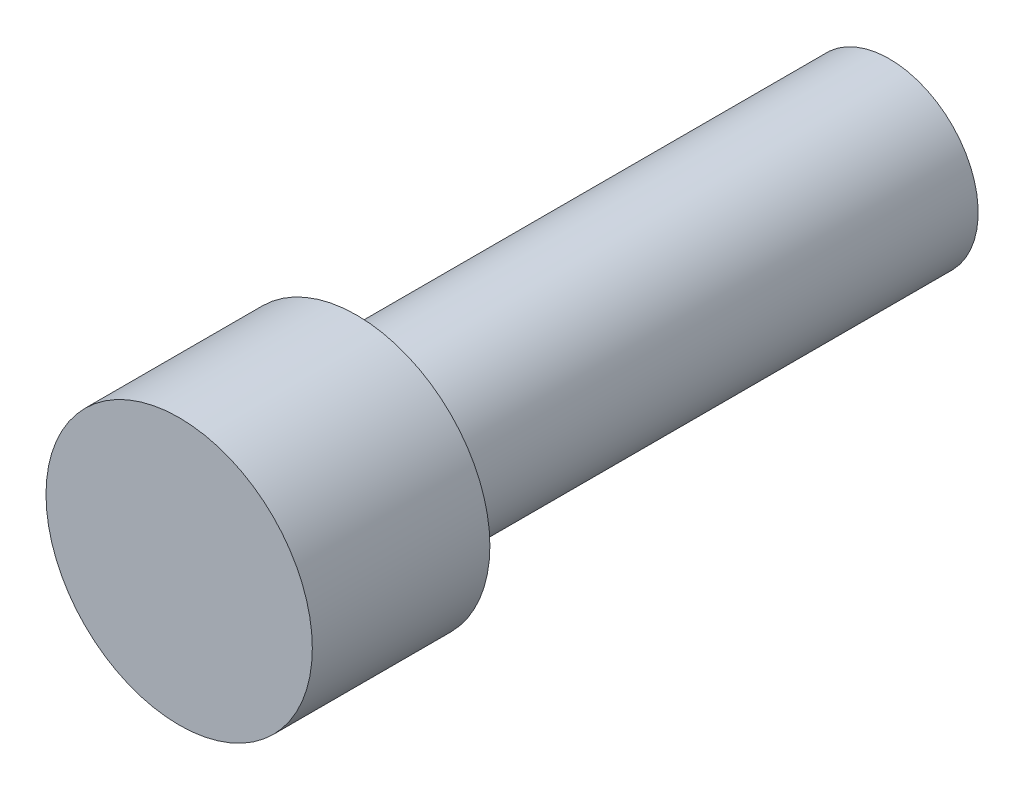
ISO-10303-21;
HEADER;
FILE_DESCRIPTION(('STEP AP214'),'2;1');
FILE_NAME('part.step','',(''),(''),'','','');
FILE_SCHEMA(('AUTOMOTIVE_DESIGN { 1 0 10303 214 1 1 1 1 }'));
ENDSEC;
DATA;
#1=APPLICATION_CONTEXT('core data for automotive mechanical design processes');
#2=APPLICATION_PROTOCOL_DEFINITION('international standard','automotive_design',2000,#1);
#3=PRODUCT_CONTEXT('',#1,'mechanical');
#4=PRODUCT('Part','Part','',(#3));
#5=PRODUCT_RELATED_PRODUCT_CATEGORY('part','',(#4));
#6=PRODUCT_DEFINITION_FORMATION('','',#4);
#7=PRODUCT_DEFINITION_CONTEXT('part definition',#1,'design');
#8=PRODUCT_DEFINITION('design','',#6,#7);
#9=PRODUCT_DEFINITION_SHAPE('','',#8);
#10=(LENGTH_UNIT() NAMED_UNIT(*) SI_UNIT(.MILLI.,.METRE.));
#11=(NAMED_UNIT(*) PLANE_ANGLE_UNIT() SI_UNIT($,.RADIAN.));
#12=(NAMED_UNIT(*) SI_UNIT($,.STERADIAN.) SOLID_ANGLE_UNIT());
#13=UNCERTAINTY_MEASURE_WITH_UNIT(LENGTH_MEASURE(1.E-05),#10,'distance_accuracy_value','');
#14=(GEOMETRIC_REPRESENTATION_CONTEXT(3) GLOBAL_UNCERTAINTY_ASSIGNED_CONTEXT((#13)) GLOBAL_UNIT_ASSIGNED_CONTEXT((#10,
#11,#12)) REPRESENTATION_CONTEXT('',''));
#15=CARTESIAN_POINT('',(0.,0.,0.));
#16=DIRECTION('',(0.,0.,1.));
#17=DIRECTION('',(1.,0.,0.));
#18=AXIS2_PLACEMENT_3D('',#15,#16,#17);
#19=CARTESIAN_POINT('',(0.,0.,2.));
#20=DIRECTION('',(0.,0.,-1.));
#21=DIRECTION('',(-1.,0.,0.));
#22=AXIS2_PLACEMENT_3D('',#19,#20,#21);
#23=CYLINDRICAL_SURFACE('',#22,1.5);
#24=CARTESIAN_POINT('',(0.,0.,2.));
#25=DIRECTION('',(0.,0.,1.));
#26=DIRECTION('',(1.,0.,0.));
#27=AXIS2_PLACEMENT_3D('',#24,#25,#26);
#28=CIRCLE('',#27,1.5);
#29=CARTESIAN_POINT('',(1.5,0.,2.));
#30=VERTEX_POINT('',#29);
#31=EDGE_CURVE('E41',#30,#30,#28,.T.);
#32=ORIENTED_EDGE('',*,*,#31,.F.);
#33=EDGE_LOOP('',(#32));
#34=FACE_BOUND('',#33,.T.);
#35=CARTESIAN_POINT('',(0.,0.,0.));
#36=DIRECTION('',(0.,0.,1.));
#37=DIRECTION('',(1.,0.,0.));
#38=AXIS2_PLACEMENT_3D('',#35,#36,#37);
#39=CIRCLE('',#38,1.5);
#40=CARTESIAN_POINT('',(1.5,0.,0.));
#41=VERTEX_POINT('',#40);
#42=EDGE_CURVE('E37',#41,#41,#39,.T.);
#43=ORIENTED_EDGE('',*,*,#42,.T.);
#44=EDGE_LOOP('',(#43));
#45=FACE_BOUND('',#44,.T.);
#46=ADVANCED_FACE('F34',(#34,#45),#23,.T.);
#47=CARTESIAN_POINT('',(0.,0.,2.));
#48=DIRECTION('',(0.,0.,1.));
#49=DIRECTION('',(1.,0.,0.));
#50=AXIS2_PLACEMENT_3D('',#47,#48,#49);
#51=PLANE('',#50);
#52=ORIENTED_EDGE('',*,*,#31,.T.);
#53=EDGE_LOOP('',(#52));
#54=FACE_BOUND('',#53,.T.);
#55=ADVANCED_FACE('F58',(#54),#51,.T.);
#56=CARTESIAN_POINT('',(0.,0.,0.));
#57=DIRECTION('',(0.,0.,1.));
#58=DIRECTION('',(1.,0.,0.));
#59=AXIS2_PLACEMENT_3D('',#56,#57,#58);
#60=PLANE('',#59);
#61=CARTESIAN_POINT('',(0.,0.,0.));
#62=DIRECTION('',(0.,0.,-1.));
#63=DIRECTION('',(-1.,0.,0.));
#64=AXIS2_PLACEMENT_3D('',#61,#62,#63);
#65=CIRCLE('',#64,1.);
#66=CARTESIAN_POINT('',(-1.,0.,0.));
#67=VERTEX_POINT('',#66);
#68=EDGE_CURVE('E10',#67,#67,#65,.T.);
#69=ORIENTED_EDGE('',*,*,#68,.F.);
#70=EDGE_LOOP('',(#69));
#71=FACE_BOUND('',#70,.T.);
#72=ORIENTED_EDGE('',*,*,#42,.F.);
#73=EDGE_LOOP('',(#72));
#74=FACE_BOUND('',#73,.T.);
#75=ADVANCED_FACE('F55',(#71,#74),#60,.F.);
#76=CARTESIAN_POINT('',(0.,0.,-6.));
#77=DIRECTION('',(0.,0.,1.));
#78=DIRECTION('',(1.,0.,0.));
#79=AXIS2_PLACEMENT_3D('',#76,#77,#78);
#80=CYLINDRICAL_SURFACE('',#79,1.);
#81=CARTESIAN_POINT('',(0.,0.,-6.));
#82=DIRECTION('',(0.,0.,-1.));
#83=DIRECTION('',(-1.,0.,0.));
#84=AXIS2_PLACEMENT_3D('',#81,#82,#83);
#85=CIRCLE('',#84,1.);
#86=CARTESIAN_POINT('',(-1.,0.,-6.));
#87=VERTEX_POINT('',#86);
#88=EDGE_CURVE('E47',#87,#87,#85,.T.);
#89=ORIENTED_EDGE('',*,*,#88,.F.);
#90=EDGE_LOOP('',(#89));
#91=FACE_BOUND('',#90,.T.);
#92=ORIENTED_EDGE('',*,*,#68,.T.);
#93=EDGE_LOOP('',(#92));
#94=FACE_BOUND('',#93,.T.);
#95=ADVANCED_FACE('F57',(#91,#94),#80,.T.);
#96=CARTESIAN_POINT('',(0.,0.,-6.));
#97=DIRECTION('',(0.,0.,-1.));
#98=DIRECTION('',(-1.,0.,0.));
#99=AXIS2_PLACEMENT_3D('',#96,#97,#98);
#100=PLANE('',#99);
#101=ORIENTED_EDGE('',*,*,#88,.T.);
#102=EDGE_LOOP('',(#101));
#103=FACE_BOUND('',#102,.T.);
#104=ADVANCED_FACE('F64',(#103),#100,.T.);
#105=CLOSED_SHELL('',(#46,#55,#75,#95,#104));
#106=MANIFOLD_SOLID_BREP('B2',#105);
#107=ADVANCED_BREP_SHAPE_REPRESENTATION('',(#18,#106),#14);
#108=SHAPE_DEFINITION_REPRESENTATION(#9,#107);
ENDSEC;
END-ISO-10303-21;
